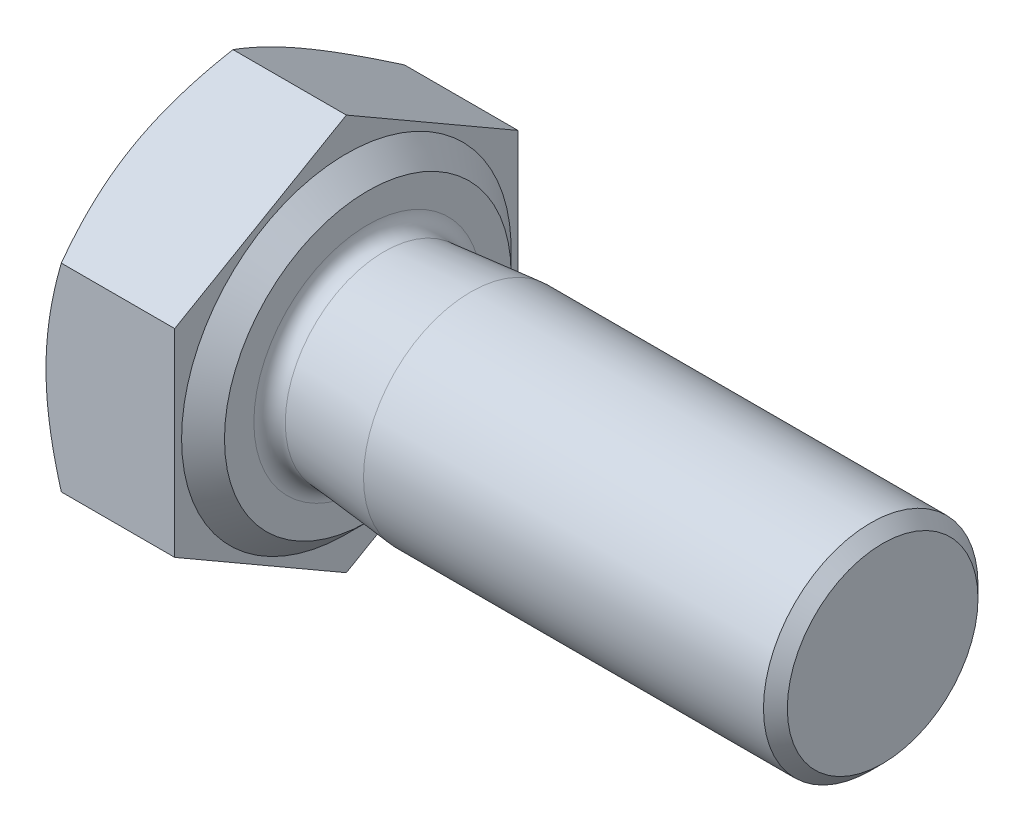
ISO-10303-21;
HEADER;
FILE_DESCRIPTION(('STEP AP214'),'2;1');
FILE_NAME('part.step','',(''),(''),'','','');
FILE_SCHEMA(('AUTOMOTIVE_DESIGN { 1 0 10303 214 1 1 1 1 }'));
ENDSEC;
DATA;
#1=APPLICATION_CONTEXT('core data for automotive mechanical design processes');
#2=APPLICATION_PROTOCOL_DEFINITION('international standard','automotive_design',2000,#1);
#3=PRODUCT_CONTEXT('',#1,'mechanical');
#4=PRODUCT('Part','Part','',(#3));
#5=PRODUCT_RELATED_PRODUCT_CATEGORY('part','',(#4));
#6=PRODUCT_DEFINITION_FORMATION('','',#4);
#7=PRODUCT_DEFINITION_CONTEXT('part definition',#1,'design');
#8=PRODUCT_DEFINITION('design','',#6,#7);
#9=PRODUCT_DEFINITION_SHAPE('','',#8);
#10=(LENGTH_UNIT() NAMED_UNIT(*) SI_UNIT(.MILLI.,.METRE.));
#11=(NAMED_UNIT(*) PLANE_ANGLE_UNIT() SI_UNIT($,.RADIAN.));
#12=(NAMED_UNIT(*) SI_UNIT($,.STERADIAN.) SOLID_ANGLE_UNIT());
#13=UNCERTAINTY_MEASURE_WITH_UNIT(LENGTH_MEASURE(1.E-05),#10,'distance_accuracy_value','');
#14=(GEOMETRIC_REPRESENTATION_CONTEXT(3) GLOBAL_UNCERTAINTY_ASSIGNED_CONTEXT((#13)) GLOBAL_UNIT_ASSIGNED_CONTEXT((#10,
#11,#12)) REPRESENTATION_CONTEXT('',''));
#15=CARTESIAN_POINT('',(0.,0.,0.));
#16=DIRECTION('',(0.,0.,1.));
#17=DIRECTION('',(1.,0.,0.));
#18=AXIS2_PLACEMENT_3D('',#15,#16,#17);
#19=CARTESIAN_POINT('',(3.5,2.30940107675851,-4.));
#20=DIRECTION('',(1.,0.,0.));
#21=DIRECTION('',(0.,0.,-1.));
#22=AXIS2_PLACEMENT_3D('',#19,#20,#21);
#23=PLANE('',#22);
#24=CARTESIAN_POINT('',(3.5,0.,0.));
#25=DIRECTION('',(-1.,0.,0.));
#26=DIRECTION('',(0.,0.,1.));
#27=AXIS2_PLACEMENT_3D('',#24,#25,#26);
#28=CIRCLE('',#27,2.65515);
#29=CARTESIAN_POINT('',(3.5,0.,2.65515));
#30=VERTEX_POINT('',#29);
#31=EDGE_CURVE('E174',#30,#30,#28,.T.);
#32=ORIENTED_EDGE('',*,*,#31,.T.);
#33=EDGE_LOOP('',(#32));
#34=FACE_BOUND('',#33,.T.);
#35=CARTESIAN_POINT('',(3.5,0.,0.));
#36=DIRECTION('',(-1.,0.,0.));
#37=DIRECTION('',(0.,0.,1.));
#38=AXIS2_PLACEMENT_3D('',#35,#36,#37);
#39=CIRCLE('',#38,3.34);
#40=CARTESIAN_POINT('',(3.5,0.,3.34));
#41=VERTEX_POINT('',#40);
#42=EDGE_CURVE('E252',#41,#41,#39,.T.);
#43=ORIENTED_EDGE('',*,*,#42,.F.);
#44=EDGE_LOOP('',(#43));
#45=FACE_BOUND('',#44,.T.);
#46=ADVANCED_FACE('F34',(#34,#45),#23,.T.);
#47=CARTESIAN_POINT('',(5.9,0.,0.));
#48=DIRECTION('',(1.,0.,0.));
#49=DIRECTION('',(0.,0.,-1.));
#50=AXIS2_PLACEMENT_3D('',#47,#48,#49);
#51=CONICAL_SURFACE('',#50,2.5,0.0955392013341482);
#52=CARTESIAN_POINT('',(3.88338787369287,0.,0.));
#53=DIRECTION('',(-1.,0.,0.));
#54=DIRECTION('',(0.,0.,1.));
#55=AXIS2_PLACEMENT_3D('',#52,#53,#54);
#56=CIRCLE('',#55,2.3067461396737);
#57=CARTESIAN_POINT('',(3.88338787369287,0.,2.3067461396737));
#58=VERTEX_POINT('',#57);
#59=EDGE_CURVE('E118',#58,#58,#56,.T.);
#60=ORIENTED_EDGE('',*,*,#59,.F.);
#61=EDGE_LOOP('',(#60));
#62=FACE_BOUND('',#61,.T.);
#63=CARTESIAN_POINT('',(5.9,0.,0.));
#64=DIRECTION('',(-1.,0.,0.));
#65=DIRECTION('',(0.,0.,1.));
#66=AXIS2_PLACEMENT_3D('',#63,#64,#65);
#67=CIRCLE('',#66,2.5);
#68=CARTESIAN_POINT('',(5.9,0.,2.5));
#69=VERTEX_POINT('',#68);
#70=EDGE_CURVE('E171',#69,#69,#67,.T.);
#71=ORIENTED_EDGE('',*,*,#70,.T.);
#72=EDGE_LOOP('',(#71));
#73=FACE_BOUND('',#72,.T.);
#74=ADVANCED_FACE('F167',(#62,#73),#51,.T.);
#75=CARTESIAN_POINT('',(3.5,0.,0.));
#76=DIRECTION('',(-1.,0.,0.));
#77=DIRECTION('',(0.,0.,1.));
#78=AXIS2_PLACEMENT_3D('',#75,#76,#77);
#79=CYLINDRICAL_SURFACE('',#78,2.5);
#80=CARTESIAN_POINT('',(15.2222222222222,0.,0.));
#81=DIRECTION('',(-1.,0.,0.));
#82=DIRECTION('',(0.,0.,1.));
#83=AXIS2_PLACEMENT_3D('',#80,#81,#82);
#84=CIRCLE('',#83,2.5);
#85=CARTESIAN_POINT('',(15.2222222222222,0.,2.5));
#86=VERTEX_POINT('',#85);
#87=EDGE_CURVE('E152',#86,#86,#84,.T.);
#88=ORIENTED_EDGE('',*,*,#87,.T.);
#89=EDGE_LOOP('',(#88));
#90=FACE_BOUND('',#89,.T.);
#91=ORIENTED_EDGE('',*,*,#70,.F.);
#92=EDGE_LOOP('',(#91));
#93=FACE_BOUND('',#92,.T.);
#94=ADVANCED_FACE('F164',(#90,#93),#79,.T.);
#95=CARTESIAN_POINT('',(15.5,2.5,0.));
#96=DIRECTION('',(-1.,0.,0.));
#97=DIRECTION('',(0.,0.,1.));
#98=AXIS2_PLACEMENT_3D('',#95,#96,#97);
#99=PLANE('',#98);
#100=CARTESIAN_POINT('',(15.5,0.,0.));
#101=DIRECTION('',(-1.,0.,0.));
#102=DIRECTION('',(0.,0.,1.));
#103=AXIS2_PLACEMENT_3D('',#100,#101,#102);
#104=CIRCLE('',#103,2.22222222222222);
#105=CARTESIAN_POINT('',(15.5,0.,2.22222222222222));
#106=VERTEX_POINT('',#105);
#107=EDGE_CURVE('E42',#106,#106,#104,.F.);
#108=ORIENTED_EDGE('',*,*,#107,.T.);
#109=EDGE_LOOP('',(#108));
#110=FACE_BOUND('',#109,.T.);
#111=ADVANCED_FACE('F157',(#110),#99,.F.);
#112=CARTESIAN_POINT('',(3.85000000000001,0.,0.));
#113=DIRECTION('',(-1.,0.,0.));
#114=DIRECTION('',(0.,0.,1.));
#115=AXIS2_PLACEMENT_3D('',#112,#113,#114);
#116=TOROIDAL_SURFACE('',#115,2.65515,0.350000000000002);
#117=ORIENTED_EDGE('',*,*,#31,.F.);
#118=EDGE_LOOP('',(#117));
#119=FACE_BOUND('',#118,.T.);
#120=ORIENTED_EDGE('',*,*,#59,.T.);
#121=EDGE_LOOP('',(#120));
#122=FACE_BOUND('',#121,.T.);
#123=ADVANCED_FACE('F161',(#119,#122),#116,.F.);
#124=CARTESIAN_POINT('',(15.2222222222222,0.,0.));
#125=DIRECTION('',(-1.,0.,0.));
#126=DIRECTION('',(0.,0.,1.));
#127=AXIS2_PLACEMENT_3D('',#124,#125,#126);
#128=CONICAL_SURFACE('',#127,2.5,0.785398163397455);
#129=ORIENTED_EDGE('',*,*,#107,.F.);
#130=EDGE_LOOP('',(#129));
#131=FACE_BOUND('',#130,.T.);
#132=ORIENTED_EDGE('',*,*,#87,.F.);
#133=EDGE_LOOP('',(#132));
#134=FACE_BOUND('',#133,.T.);
#135=ADVANCED_FACE('F36',(#131,#134),#128,.T.);
#136=CARTESIAN_POINT('',(3.,-3.84,0.));
#137=DIRECTION('',(1.,0.,0.));
#138=DIRECTION('',(0.,0.,-1.));
#139=AXIS2_PLACEMENT_3D('',#136,#137,#138);
#140=PLANE('',#139);
#141=CARTESIAN_POINT('',(3.,0.,0.));
#142=DIRECTION('',(-1.,0.,0.));
#143=DIRECTION('',(0.,0.,1.));
#144=AXIS2_PLACEMENT_3D('',#141,#142,#143);
#145=CIRCLE('',#144,3.84);
#146=CARTESIAN_POINT('',(3.,0.,3.84));
#147=VERTEX_POINT('',#146);
#148=EDGE_CURVE('E254',#147,#147,#145,.T.);
#149=ORIENTED_EDGE('',*,*,#148,.T.);
#150=EDGE_LOOP('',(#149));
#151=FACE_BOUND('',#150,.T.);
#152=DIRECTION('',(0.,1.,0.));
#153=VECTOR('',#152,1.);
#154=CARTESIAN_POINT('',(3.,-2.30940107675854,-3.99999999999998));
#155=LINE('',#154,#153);
#156=CARTESIAN_POINT('',(3.,-2.30940107675854,-3.99999999999998));
#157=VERTEX_POINT('',#156);
#158=CARTESIAN_POINT('',(3.,2.30940107675851,-4.));
#159=VERTEX_POINT('',#158);
#160=EDGE_CURVE('E105',#157,#159,#155,.T.);
#161=ORIENTED_EDGE('',*,*,#160,.T.);
#162=DIRECTION('',(0.,0.5,0.866025403784439));
#163=VECTOR('',#162,1.);
#164=CARTESIAN_POINT('',(3.,2.30940107675851,-4.));
#165=LINE('',#164,#163);
#166=CARTESIAN_POINT('',(3.,4.61880215351701,0.));
#167=VERTEX_POINT('',#166);
#168=EDGE_CURVE('E119',#159,#167,#165,.T.);
#169=ORIENTED_EDGE('',*,*,#168,.T.);
#170=DIRECTION('',(0.,-0.499999999999999,0.866025403784439));
#171=VECTOR('',#170,1.);
#172=CARTESIAN_POINT('',(3.,4.61880215351701,0.));
#173=LINE('',#172,#171);
#174=CARTESIAN_POINT('',(3.,2.30940107675851,4.));
#175=VERTEX_POINT('',#174);
#176=EDGE_CURVE('E262',#167,#175,#173,.T.);
#177=ORIENTED_EDGE('',*,*,#176,.T.);
#178=DIRECTION('',(0.,-1.,0.));
#179=VECTOR('',#178,1.);
#180=CARTESIAN_POINT('',(3.,2.30940107675851,4.));
#181=LINE('',#180,#179);
#182=CARTESIAN_POINT('',(3.,-2.30940107675849,4.00000000000001));
#183=VERTEX_POINT('',#182);
#184=EDGE_CURVE('E260',#175,#183,#181,.T.);
#185=ORIENTED_EDGE('',*,*,#184,.T.);
#186=DIRECTION('',(0.,-0.500000000000001,-0.866025403784438));
#187=VECTOR('',#186,1.);
#188=CARTESIAN_POINT('',(3.,-2.30940107675849,4.00000000000001));
#189=LINE('',#188,#187);
#190=CARTESIAN_POINT('',(3.,-4.61880215351701,0.));
#191=VERTEX_POINT('',#190);
#192=EDGE_CURVE('E48',#183,#191,#189,.T.);
#193=ORIENTED_EDGE('',*,*,#192,.T.);
#194=DIRECTION('',(0.,0.499999999999997,-0.86602540378444));
#195=VECTOR('',#194,1.);
#196=CARTESIAN_POINT('',(3.,-4.61880215351701,0.));
#197=LINE('',#196,#195);
#198=EDGE_CURVE('E11',#191,#157,#197,.T.);
#199=ORIENTED_EDGE('',*,*,#198,.T.);
#200=EDGE_LOOP('',(#161,#169,#177,#185,#193,#199));
#201=FACE_BOUND('',#200,.T.);
#202=ADVANCED_FACE('F104',(#151,#201),#140,.T.);
#203=CARTESIAN_POINT('',(3.,0.,0.));
#204=DIRECTION('',(-1.,0.,0.));
#205=DIRECTION('',(0.,0.,1.));
#206=AXIS2_PLACEMENT_3D('',#203,#204,#205);
#207=CONICAL_SURFACE('',#206,3.84,0.785398163397442);
#208=ORIENTED_EDGE('',*,*,#42,.T.);
#209=EDGE_LOOP('',(#208));
#210=FACE_BOUND('',#209,.T.);
#211=ORIENTED_EDGE('',*,*,#148,.F.);
#212=EDGE_LOOP('',(#211));
#213=FACE_BOUND('',#212,.T.);
#214=ADVANCED_FACE('F277',(#210,#213),#207,.T.);
#215=CARTESIAN_POINT('',(0.,2.30940107675851,-4.));
#216=DIRECTION('',(1.,0.,0.));
#217=DIRECTION('',(0.,0.,-1.));
#218=AXIS2_PLACEMENT_3D('',#215,#216,#217);
#219=PLANE('',#218);
#220=CARTESIAN_POINT('',(0.,0.,0.));
#221=DIRECTION('',(1.,0.,0.));
#222=DIRECTION('',(0.,0.,-1.));
#223=AXIS2_PLACEMENT_3D('',#220,#221,#222);
#224=CIRCLE('',#223,4.);
#225=CARTESIAN_POINT('',(0.,0.,-4.));
#226=VERTEX_POINT('',#225);
#227=CARTESIAN_POINT('',(0.,3.46410161513775,-2.));
#228=VERTEX_POINT('',#227);
#229=EDGE_CURVE('E151',#226,#228,#224,.T.);
#230=ORIENTED_EDGE('',*,*,#229,.F.);
#231=CARTESIAN_POINT('',(0.,-3.46410161513777,-2.));
#232=VERTEX_POINT('',#231);
#233=EDGE_CURVE('E147',#232,#226,#224,.T.);
#234=ORIENTED_EDGE('',*,*,#233,.F.);
#235=CARTESIAN_POINT('',(0.,-3.46410161513775,2.));
#236=VERTEX_POINT('',#235);
#237=EDGE_CURVE('E150',#236,#232,#224,.T.);
#238=ORIENTED_EDGE('',*,*,#237,.F.);
#239=CARTESIAN_POINT('',(0.,0.,4.));
#240=VERTEX_POINT('',#239);
#241=EDGE_CURVE('E318',#240,#236,#224,.T.);
#242=ORIENTED_EDGE('',*,*,#241,.F.);
#243=CARTESIAN_POINT('',(0.,0.,0.));
#244=DIRECTION('',(-1.,0.,0.));
#245=DIRECTION('',(0.,0.,1.));
#246=AXIS2_PLACEMENT_3D('',#243,#244,#245);
#247=CIRCLE('',#246,4.);
#248=CARTESIAN_POINT('',(0.,3.46410161513775,2.));
#249=VERTEX_POINT('',#248);
#250=EDGE_CURVE('E173',#240,#249,#247,.T.);
#251=ORIENTED_EDGE('',*,*,#250,.T.);
#252=EDGE_CURVE('E295',#228,#249,#224,.T.);
#253=ORIENTED_EDGE('',*,*,#252,.F.);
#254=EDGE_LOOP('',(#230,#234,#238,#242,#251,#253));
#255=FACE_BOUND('',#254,.T.);
#256=ADVANCED_FACE('F280',(#255),#219,.F.);
#257=CARTESIAN_POINT('',(0.,0.,0.));
#258=DIRECTION('',(1.,0.,0.));
#259=DIRECTION('',(0.,0.,1.));
#260=AXIS2_PLACEMENT_3D('',#257,#258,#259);
#261=CONICAL_SURFACE('',#260,4.,1.0471975511966);
#262=CARTESIAN_POINT('',(0.35733225907477,4.61891762357085,0.00019999999999805));
#263=CARTESIAN_POINT('',(0.298717873648286,4.51743148381381,-0.175579150323231));
#264=CARTESIAN_POINT('',(0.245410321462266,4.41506932144052,-0.352875616326384));
#265=CARTESIAN_POINT('',(0.152361670746407,4.2085725054774,-0.710538593175709));
#266=CARTESIAN_POINT('',(0.112653489029708,4.10443418285647,-0.890911458970154));
#267=CARTESIAN_POINT('',(0.0508422152802831,3.89744813015756,-1.24942181870279));
#268=CARTESIAN_POINT('',(0.0283277315228931,3.7946322465506,-1.42750415293515));
#269=CARTESIAN_POINT('',(0.00145062314658626,3.58851671999023,-1.78450671716651));
#270=CARTESIAN_POINT('',(-0.00293425857305235,3.48521782616117,-1.9634256496441));
#271=CARTESIAN_POINT('',(0.00619007293997495,3.29219970504619,-2.29774284219674));
#272=CARTESIAN_POINT('',(0.0174589539879991,3.20245157692487,-2.45319115998707));
#273=CARTESIAN_POINT('',(0.0531739907981978,3.02354002635497,-2.76307505563506));
#274=CARTESIAN_POINT('',(0.0776323457115373,2.93437722268073,-2.91750956174413));
#275=CARTESIAN_POINT('',(0.138776064919293,2.75509682012355,-3.22803232777458));
#276=CARTESIAN_POINT('',(0.175720603654866,2.66500191089421,-3.3840812880631));
#277=CARTESIAN_POINT('',(0.259570072548029,2.48615580200001,-3.69385183540384));
#278=CARTESIAN_POINT('',(0.306455302212742,2.39740231122586,-3.84757739077378));
#279=CARTESIAN_POINT('',(0.357332259074768,2.30928560670467,-4.0002));
#280=B_SPLINE_CURVE_WITH_KNOTS('',3,(#262,#263,#264,#265,#266,#267,#268,#269,#270,#271,#272,
#273,#274,#275,#276,#277,#278,#279),.UNSPECIFIED.,.F.,.F.,(4,2,2,2,2,2,2,2,4),(0.,
0.634047835695966,1.26961969224543,1.88946157213122,2.50854226669297,3.04757825393386,
3.58711366126903,4.13861653143763,4.68903648037742),.UNSPECIFIED.);
#281=CARTESIAN_POINT('',(0.357265589908164,2.30940107675851,-4.));
#282=VERTEX_POINT('',#281);
#283=EDGE_CURVE('E225',#228,#282,#280,.T.);
#284=ORIENTED_EDGE('',*,*,#283,.T.);
#285=CARTESIAN_POINT('',(1.91949131906031,-6.13600787860014,-3.99999999999997));
#286=CARTESIAN_POINT('',(1.83453254114692,-5.96029824528281,-3.99999999999997));
#287=CARTESIAN_POINT('',(1.75041491774215,-5.78417443504921,-3.99999999999997));
#288=CARTESIAN_POINT('',(1.58434238711561,-5.43087457241901,-3.99999999999997));
#289=CARTESIAN_POINT('',(1.50238785174126,-5.25369834543672,-3.99999999999997));
#290=CARTESIAN_POINT('',(1.34069258944118,-4.89711815344377,-3.99999999999997));
#291=CARTESIAN_POINT('',(1.2609671107701,-4.71770724899219,-3.99999999999998));
#292=CARTESIAN_POINT('',(1.10492454769553,-4.35741495082771,-3.99999999999998));
#293=CARTESIAN_POINT('',(1.0286072865682,-4.17653363393527,-3.99999999999998));
#294=CARTESIAN_POINT('',(0.879359740575396,-3.81071561786163,-3.99999999999998));
#295=CARTESIAN_POINT('',(0.80648405731675,-3.62575651977364,-3.99999999999998));
#296=CARTESIAN_POINT('',(0.666412540786886,-3.25366068255849,-3.99999999999998));
#297=CARTESIAN_POINT('',(0.599217338066289,-3.06652370429613,-3.99999999999998));
#298=CARTESIAN_POINT('',(0.472304167658768,-2.69015503897306,-3.99999999999998));
#299=CARTESIAN_POINT('',(0.412570399692845,-2.50092873463207,-3.99999999999998));
#300=CARTESIAN_POINT('',(0.302512840080975,-2.11978551535808,-3.99999999999998));
#301=CARTESIAN_POINT('',(0.252186084020131,-1.92786946860207,-3.99999999999998));
#302=CARTESIAN_POINT('',(0.163379771912551,-1.54122028912674,-3.99999999999999));
#303=CARTESIAN_POINT('',(0.124902777698588,-1.34648655675811,-3.99999999999999));
#304=CARTESIAN_POINT('',(0.0623769826458263,-0.954658832260081,-3.99999999999999));
#305=CARTESIAN_POINT('',(0.0383281826610804,-0.757564839990973,-3.99999999999999));
#306=CARTESIAN_POINT('',(0.00678594419352145,-0.363304194123938,-3.99999999999999));
#307=CARTESIAN_POINT('',(-0.000813464833915623,-0.166146239239637,-3.99999999999999));
#308=CARTESIAN_POINT('',(0.000951740706278187,0.228050062110494,-3.99999999999999));
#309=CARTESIAN_POINT('',(0.0103118940041482,0.425088426396362,-3.99999999999999));
#310=CARTESIAN_POINT('',(0.040085248119804,0.761210581117507,-3.99999999999999));
#311=CARTESIAN_POINT('',(0.0565453952791145,0.900664377876312,-3.99999999999999));
#312=CARTESIAN_POINT('',(0.0968962874886259,1.17850220880597,-3.99999999999999));
#313=CARTESIAN_POINT('',(0.120788195049948,1.31688607213958,-3.99999999999999));
#314=CARTESIAN_POINT('',(0.202358575058061,1.73031595246286,-3.99999999999999));
#315=CARTESIAN_POINT('',(0.269910951597834,2.00343275055545,-4.));
#316=CARTESIAN_POINT('',(0.386514913879454,2.41213205945729,-4.));
#317=CARTESIAN_POINT('',(0.428526952638739,2.54984255586082,-4.));
#318=CARTESIAN_POINT('',(0.516731740349217,2.82382651940195,-4.));
#319=CARTESIAN_POINT('',(0.562921614665063,2.96010090367581,-4.));
#320=CARTESIAN_POINT('',(0.658519068779255,3.23064293966594,-4.));
#321=CARTESIAN_POINT('',(0.707907115663071,3.36491756386987,-4.));
#322=CARTESIAN_POINT('',(0.809597306890866,3.63242301131994,-4.));
#323=CARTESIAN_POINT('',(0.861900619604669,3.76565339130134,-4.));
#324=CARTESIAN_POINT('',(0.915374388530293,3.89840100612876,-4.));
#325=B_SPLINE_CURVE_WITH_KNOTS('',3,(#285,#286,#287,#288,#289,#290,#291,#292,#293,#294,#295,
#296,#297,#298,#299,#300,#301,#302,#303,#304,#305,#306,#307,#308,#309,#310,#311,#312,#313,#314,
#315,#316,#317,#318,#319,#320,#321,#322,#323,#324),.UNSPECIFIED.,.F.,.F.,(4,2,2,2,2,2,2,2,2,2,2,
2,2,2,2,2,2,2,2,4),(0.,0.585521951029805,1.17114390962969,1.76009774380607,2.34902100384485,
2.94534356731019,3.54173223771425,4.13683578232763,4.73175147568506,5.32679569536903,
5.92183995027563,6.51303924843911,7.10408305222163,7.52514324349571,7.94626933214689,
8.78914432607458,9.22103879153916,9.65263831261068,10.0818133381383,10.5111616212701),.UNSPECIFIED.);
#326=EDGE_CURVE('E297',#282,#226,#325,.F.);
#327=ORIENTED_EDGE('',*,*,#326,.T.);
#328=ORIENTED_EDGE('',*,*,#229,.T.);
#329=EDGE_LOOP('',(#284,#327,#328));
#330=FACE_BOUND('',#329,.T.);
#331=ADVANCED_FACE('F284',(#330),#261,.T.);
#332=CARTESIAN_POINT('',(0.357332259074769,2.30928560670467,4.0002));
#333=CARTESIAN_POINT('',(0.298717873648285,2.41077174646171,3.82442084967677));
#334=CARTESIAN_POINT('',(0.245410321462265,2.513133908835,3.64712438367362));
#335=CARTESIAN_POINT('',(0.152361670746406,2.71963072479812,3.28946140682429));
#336=CARTESIAN_POINT('',(0.112653489029707,2.82376904741905,3.10908854102984));
#337=CARTESIAN_POINT('',(0.0508422152802822,3.03075510011796,2.75057818129721));
#338=CARTESIAN_POINT('',(0.0283277315228925,3.13357098372492,2.57249584706485));
#339=CARTESIAN_POINT('',(0.0014506231465858,3.33968651028529,2.21549328283349));
#340=CARTESIAN_POINT('',(-0.00293425857305308,3.44298540411435,2.03657435035589));
#341=CARTESIAN_POINT('',(0.00619007293997406,3.63600352522933,1.70225715780326));
#342=CARTESIAN_POINT('',(0.0174589539879983,3.72575165335065,1.54680884001293));
#343=CARTESIAN_POINT('',(0.0531739907981973,3.90466320392055,1.23692494436494));
#344=CARTESIAN_POINT('',(0.0776323457115371,3.99382600759479,1.08249043825587));
#345=CARTESIAN_POINT('',(0.138776064919293,4.17310641015198,0.771967672225418));
#346=CARTESIAN_POINT('',(0.175720603654867,4.26320131938132,0.615918711936894));
#347=CARTESIAN_POINT('',(0.25957007254803,4.44204742827551,0.306148164596158));
#348=CARTESIAN_POINT('',(0.306455302212743,4.53080091904967,0.152422609226218));
#349=CARTESIAN_POINT('',(0.35733225907477,4.61891762357085,-0.000200000000001869));
#350=B_SPLINE_CURVE_WITH_KNOTS('',3,(#332,#333,#334,#335,#336,#337,#338,#339,#340,#341,#342,
#343,#344,#345,#346,#347,#348,#349),.UNSPECIFIED.,.F.,.F.,(4,2,2,2,2,2,2,2,4),(0.,
0.634047835695965,1.26961969224543,1.88946157213122,2.50854226669297,3.04757825393386,
3.58711366126903,4.13861653143763,4.68903648037743),.UNSPECIFIED.);
#351=CARTESIAN_POINT('',(0.357265589908166,4.61880215351701,0.));
#352=VERTEX_POINT('',#351);
#353=EDGE_CURVE('E131',#249,#352,#350,.T.);
#354=ORIENTED_EDGE('',*,*,#353,.T.);
#355=EDGE_CURVE('E56',#352,#228,#280,.T.);
#356=ORIENTED_EDGE('',*,*,#355,.T.);
#357=ORIENTED_EDGE('',*,*,#252,.T.);
#358=EDGE_LOOP('',(#354,#356,#357));
#359=FACE_BOUND('',#358,.T.);
#360=ADVANCED_FACE('F205',(#359),#261,.T.);
#361=CARTESIAN_POINT('',(0.357265589908164,2.30940107675851,4.));
#362=VERTEX_POINT('',#361);
#363=EDGE_CURVE('E127',#362,#249,#350,.T.);
#364=ORIENTED_EDGE('',*,*,#363,.T.);
#365=ORIENTED_EDGE('',*,*,#250,.F.);
#366=CARTESIAN_POINT('',(1.91949120646931,-6.13600764580939,4.00000000000002));
#367=CARTESIAN_POINT('',(1.83453243337032,-5.96029802046226,4.00000000000002));
#368=CARTESIAN_POINT('',(1.75041481477709,-5.78417421820494,4.00000000000002));
#369=CARTESIAN_POINT('',(1.58434229374799,-5.43087437155386,4.00000000000002));
#370=CARTESIAN_POINT('',(1.50238776315955,-5.25369815257442,4.00000000000002));
#371=CARTESIAN_POINT('',(1.34069251043344,-4.89711797672013,4.00000000000002));
#372=CARTESIAN_POINT('',(1.26096703654941,-4.71770708040489,4.00000000000002));
#373=CARTESIAN_POINT('',(1.10492448296113,-4.35741479857339,4.00000000000002));
#374=CARTESIAN_POINT('',(1.02860722653305,-4.17653348987757,4.00000000000002));
#375=CARTESIAN_POINT('',(0.879359689861999,-3.81071549042518,4.00000000000002));
#376=CARTESIAN_POINT('',(0.806484011223184,-3.62575640076333,4.00000000000002));
#377=CARTESIAN_POINT('',(0.666412503677517,-3.25366058054104,4.00000000000001));
#378=CARTESIAN_POINT('',(0.599217305321195,-3.06652361084543,4.00000000000001));
#379=CARTESIAN_POINT('',(0.472304143209208,-2.69015496281749,4.00000000000001));
#380=CARTESIAN_POINT('',(0.412570379175942,-2.5009286672043,4.00000000000001));
#381=CARTESIAN_POINT('',(0.302512826766215,-2.1197854656258,4.00000000000001));
#382=CARTESIAN_POINT('',(0.252186073975287,-1.92786942783734,4.00000000000001));
#383=CARTESIAN_POINT('',(0.163379768486074,-1.54122027124256,4.00000000000001));
#384=CARTESIAN_POINT('',(0.124902777334436,-1.34648655285392,4.00000000000001));
#385=CARTESIAN_POINT('',(0.0623769862766003,-0.954658856631734,4.00000000000001));
#386=CARTESIAN_POINT('',(0.0383281872259856,-0.757564878658228,4.00000000000001));
#387=CARTESIAN_POINT('',(0.00678594810879021,-0.363304261313727,4.));
#388=CARTESIAN_POINT('',(-0.000813462481064327,-0.16614632065538,4.));
#389=CARTESIAN_POINT('',(0.000951737499979277,0.22804995248298,4.));
#390=CARTESIAN_POINT('',(0.0103118868006022,0.425088302782968,4.));
#391=CARTESIAN_POINT('',(0.0400852329091964,0.761210439648584,4.));
#392=CARTESIAN_POINT('',(0.0565453768668471,0.900664232381911,4.));
#393=CARTESIAN_POINT('',(0.0968962624971283,1.17850205543051,4.));
#394=CARTESIAN_POINT('',(0.120788166680851,1.31688591490858,4.));
#395=CARTESIAN_POINT('',(0.202358536474655,1.73031578385203,4.));
#396=CARTESIAN_POINT('',(0.269910906102915,2.00343257463138,4.));
#397=CARTESIAN_POINT('',(0.386514858161894,2.41213187260233,4.));
#398=CARTESIAN_POINT('',(0.428526893488739,2.54984236530054,4.));
#399=CARTESIAN_POINT('',(0.51673167443411,2.82382632147354,3.99999999999999));
#400=CARTESIAN_POINT('',(0.562921545417337,2.96010070208453,3.99999999999999));
#401=CARTESIAN_POINT('',(0.658518992997691,3.23064273080269,3.99999999999999));
#402=CARTESIAN_POINT('',(0.707907036680203,3.36491735139727,3.99999999999999));
#403=CARTESIAN_POINT('',(0.809597221602637,3.63242279162073,3.99999999999999));
#404=CARTESIAN_POINT('',(0.861900531212279,3.76565316798494,3.99999999999999));
#405=CARTESIAN_POINT('',(0.915374297081839,3.89840077918901,3.99999999999999));
#406=B_SPLINE_CURVE_WITH_KNOTS('',3,(#366,#367,#368,#369,#370,#371,#372,#373,#374,#375,#376,
#377,#378,#379,#380,#381,#382,#383,#384,#385,#386,#387,#388,#389,#390,#391,#392,#393,#394,#395,
#396,#397,#398,#399,#400,#401,#402,#403,#404,#405),.UNSPECIFIED.,.F.,.F.,(4,2,2,2,2,2,2,2,2,2,2,
2,2,2,2,2,2,2,2,4),(0.,0.585521923216113,1.17114385399772,1.76009766003639,2.3490208919397,
2.94534342680831,3.54173206860598,4.13683558471493,4.73175124959096,5.32679542644494,
5.92183963858471,6.51303889444524,7.10408265589568,7.52514283405346,7.94626890958621,
8.78914387720299,9.22103832902587,9.6526378364765,10.0818128485231,10.5111611181472),.UNSPECIFIED.);
#407=EDGE_CURVE('E308',#240,#362,#406,.T.);
#408=ORIENTED_EDGE('',*,*,#407,.T.);
#409=EDGE_LOOP('',(#364,#365,#408));
#410=FACE_BOUND('',#409,.T.);
#411=ADVANCED_FACE('F199',(#410),#261,.T.);
#412=CARTESIAN_POINT('',(0.357265589908165,-2.30940107675849,4.00000000000001));
#413=VERTEX_POINT('',#412);
#414=EDGE_CURVE('E219',#413,#240,#406,.T.);
#415=ORIENTED_EDGE('',*,*,#414,.T.);
#416=ORIENTED_EDGE('',*,*,#241,.T.);
#417=CARTESIAN_POINT('',(0.357332259074769,-4.61891762357085,-0.000200000000004817));
#418=CARTESIAN_POINT('',(0.298717873648285,-4.51743148381381,0.175579150323223));
#419=CARTESIAN_POINT('',(0.245410321462265,-4.41506932144052,0.352875616326376));
#420=CARTESIAN_POINT('',(0.152361670746406,-4.2085725054774,0.710538593175702));
#421=CARTESIAN_POINT('',(0.112653489029706,-4.10443418285647,0.890911458970146));
#422=CARTESIAN_POINT('',(0.0508422152802806,-3.89744813015756,1.24942181870279));
#423=CARTESIAN_POINT('',(0.0283277315228898,-3.79463224655059,1.42750415293514));
#424=CARTESIAN_POINT('',(0.00145062314658228,-3.58851671999023,1.7845067171665));
#425=CARTESIAN_POINT('',(-0.00293425857305625,-3.48521782616117,1.96342564964409));
#426=CARTESIAN_POINT('',(0.00619007293997031,-3.29219970504619,2.29774284219673));
#427=CARTESIAN_POINT('',(0.0174589539879939,-3.20245157692486,2.45319115998706));
#428=CARTESIAN_POINT('',(0.0531739907981924,-3.02354002635496,2.76307505563505));
#429=CARTESIAN_POINT('',(0.0776323457115322,-2.93437722268072,2.91750956174413));
#430=CARTESIAN_POINT('',(0.138776064919289,-2.75509682012353,3.22803232777458));
#431=CARTESIAN_POINT('',(0.175720603654864,-2.66500191089419,3.38408128806311));
#432=CARTESIAN_POINT('',(0.259570072548029,-2.486155802,3.69385183540385));
#433=CARTESIAN_POINT('',(0.306455302212743,-2.39740231122584,3.84757739077379));
#434=CARTESIAN_POINT('',(0.357332259074769,-2.30928560670465,4.00020000000001));
#435=B_SPLINE_CURVE_WITH_KNOTS('',3,(#417,#418,#419,#420,#421,#422,#423,#424,#425,#426,#427,
#428,#429,#430,#431,#432,#433,#434),.UNSPECIFIED.,.F.,.F.,(4,2,2,2,2,2,2,2,4),(0.,
0.634047835695966,1.26961969224543,1.88946157213122,2.50854226669297,3.04757825393386,
3.58711366126904,4.13861653143765,4.68903648037745),.UNSPECIFIED.);
#436=EDGE_CURVE('E299',#236,#413,#435,.T.);
#437=ORIENTED_EDGE('',*,*,#436,.T.);
#438=EDGE_LOOP('',(#415,#416,#437));
#439=FACE_BOUND('',#438,.T.);
#440=ADVANCED_FACE('F204',(#439),#261,.T.);
#441=CARTESIAN_POINT('',(0.357265589908165,-2.30940107675854,-3.99999999999998));
#442=VERTEX_POINT('',#441);
#443=EDGE_CURVE('E213',#226,#442,#325,.F.);
#444=ORIENTED_EDGE('',*,*,#443,.T.);
#445=CARTESIAN_POINT('',(0.357332259074769,-2.3092856067047,-4.00019999999998));
#446=CARTESIAN_POINT('',(0.298717873648285,-2.41077174646174,-3.82442084967675));
#447=CARTESIAN_POINT('',(0.245410321462266,-2.51313390883503,-3.6471243836736));
#448=CARTESIAN_POINT('',(0.152361670746408,-2.71963072479815,-3.28946140682427));
#449=CARTESIAN_POINT('',(0.112653489029709,-2.82376904741907,-3.10908854102983));
#450=CARTESIAN_POINT('',(0.0508422152802854,-3.03075510011798,-2.75057818129719));
#451=CARTESIAN_POINT('',(0.028327731522896,-3.13357098372495,-2.57249584706484));
#452=CARTESIAN_POINT('',(0.00145062314659007,-3.33968651028531,-2.21549328283347));
#453=CARTESIAN_POINT('',(-0.00293425857304821,-3.44298540411437,-2.03657435035588));
#454=CARTESIAN_POINT('',(0.00619007293997994,-3.63600352522935,-1.70225715780325));
#455=CARTESIAN_POINT('',(0.0174589539880044,-3.72575165335067,-1.54680884001292));
#456=CARTESIAN_POINT('',(0.0531739907982031,-3.90466320392056,-1.23692494436493));
#457=CARTESIAN_POINT('',(0.0776323457115423,-3.9938260075948,-1.08249043825586));
#458=CARTESIAN_POINT('',(0.138776064919297,-4.17310641015198,-0.771967672225415));
#459=CARTESIAN_POINT('',(0.175720603654871,-4.26320131938132,-0.615918711936893));
#460=CARTESIAN_POINT('',(0.259570072548033,-4.44204742827551,-0.306148164596161));
#461=CARTESIAN_POINT('',(0.306455302212745,-4.53080091904967,-0.152422609226223));
#462=CARTESIAN_POINT('',(0.35733225907477,-4.61891762357085,0.000199999999995354));
#463=B_SPLINE_CURVE_WITH_KNOTS('',3,(#445,#446,#447,#448,#449,#450,#451,#452,#453,#454,#455,
#456,#457,#458,#459,#460,#461,#462),.UNSPECIFIED.,.F.,.F.,(4,2,2,2,2,2,2,2,4),(0.,
0.634047835695966,1.26961969224543,1.88946157213122,2.50854226669297,3.04757825393385,
3.58711366126902,4.13861653143761,4.6890364803774),.UNSPECIFIED.);
#464=EDGE_CURVE('E125',#442,#232,#463,.T.);
#465=ORIENTED_EDGE('',*,*,#464,.T.);
#466=ORIENTED_EDGE('',*,*,#233,.T.);
#467=EDGE_LOOP('',(#444,#465,#466));
#468=FACE_BOUND('',#467,.T.);
#469=ADVANCED_FACE('F316',(#468),#261,.T.);
#470=CARTESIAN_POINT('',(0.357265589908166,-4.61880215351701,0.));
#471=VERTEX_POINT('',#470);
#472=EDGE_CURVE('E190',#471,#236,#435,.T.);
#473=ORIENTED_EDGE('',*,*,#472,.T.);
#474=ORIENTED_EDGE('',*,*,#237,.T.);
#475=EDGE_CURVE('E177',#232,#471,#463,.T.);
#476=ORIENTED_EDGE('',*,*,#475,.T.);
#477=EDGE_LOOP('',(#473,#474,#476));
#478=FACE_BOUND('',#477,.T.);
#479=ADVANCED_FACE('F207',(#478),#261,.T.);
#480=CARTESIAN_POINT('',(3.5,-4.61880215351701,0.));
#481=DIRECTION('',(0.,0.86602540378444,0.499999999999997));
#482=DIRECTION('',(0.,-0.499999999999997,0.86602540378444));
#483=AXIS2_PLACEMENT_3D('',#480,#481,#482);
#484=PLANE('',#483);
#485=ORIENTED_EDGE('',*,*,#198,.F.);
#486=DIRECTION('',(-1.,0.,0.));
#487=VECTOR('',#486,1.);
#488=CARTESIAN_POINT('',(3.5,-4.61880215351701,0.));
#489=LINE('',#488,#487);
#490=EDGE_CURVE('E126',#191,#471,#489,.T.);
#491=ORIENTED_EDGE('',*,*,#490,.T.);
#492=ORIENTED_EDGE('',*,*,#475,.F.);
#493=ORIENTED_EDGE('',*,*,#464,.F.);
#494=DIRECTION('',(-1.,0.,0.));
#495=VECTOR('',#494,1.);
#496=CARTESIAN_POINT('',(3.5,-2.30940107675854,-3.99999999999998));
#497=LINE('',#496,#495);
#498=EDGE_CURVE('E114',#157,#442,#497,.T.);
#499=ORIENTED_EDGE('',*,*,#498,.F.);
#500=EDGE_LOOP('',(#485,#491,#492,#493,#499));
#501=FACE_BOUND('',#500,.T.);
#502=ADVANCED_FACE('F122',(#501),#484,.F.);
#503=CARTESIAN_POINT('',(3.5,-2.30940107675849,4.00000000000001));
#504=DIRECTION('',(0.,0.866025403784438,-0.500000000000001));
#505=DIRECTION('',(0.,0.500000000000001,0.866025403784438));
#506=AXIS2_PLACEMENT_3D('',#503,#504,#505);
#507=PLANE('',#506);
#508=ORIENTED_EDGE('',*,*,#192,.F.);
#509=DIRECTION('',(-1.,0.,0.));
#510=VECTOR('',#509,1.);
#511=CARTESIAN_POINT('',(3.5,-2.30940107675849,4.00000000000001));
#512=LINE('',#511,#510);
#513=EDGE_CURVE('E129',#183,#413,#512,.T.);
#514=ORIENTED_EDGE('',*,*,#513,.T.);
#515=ORIENTED_EDGE('',*,*,#436,.F.);
#516=ORIENTED_EDGE('',*,*,#472,.F.);
#517=ORIENTED_EDGE('',*,*,#490,.F.);
#518=EDGE_LOOP('',(#508,#514,#515,#516,#517));
#519=FACE_BOUND('',#518,.T.);
#520=ADVANCED_FACE('F320',(#519),#507,.F.);
#521=CARTESIAN_POINT('',(3.5,2.30940107675851,4.));
#522=DIRECTION('',(0.,0.,-1.));
#523=DIRECTION('',(0.,1.,0.));
#524=AXIS2_PLACEMENT_3D('',#521,#522,#523);
#525=PLANE('',#524);
#526=ORIENTED_EDGE('',*,*,#184,.F.);
#527=DIRECTION('',(-1.,0.,0.));
#528=VECTOR('',#527,1.);
#529=CARTESIAN_POINT('',(3.5,2.30940107675851,4.));
#530=LINE('',#529,#528);
#531=EDGE_CURVE('E142',#175,#362,#530,.T.);
#532=ORIENTED_EDGE('',*,*,#531,.T.);
#533=ORIENTED_EDGE('',*,*,#407,.F.);
#534=ORIENTED_EDGE('',*,*,#414,.F.);
#535=ORIENTED_EDGE('',*,*,#513,.F.);
#536=EDGE_LOOP('',(#526,#532,#533,#534,#535));
#537=FACE_BOUND('',#536,.T.);
#538=ADVANCED_FACE('F324',(#537),#525,.F.);
#539=CARTESIAN_POINT('',(3.5,4.61880215351701,0.));
#540=DIRECTION('',(0.,-0.866025403784439,-0.499999999999999));
#541=DIRECTION('',(0.,0.499999999999999,-0.866025403784439));
#542=AXIS2_PLACEMENT_3D('',#539,#540,#541);
#543=PLANE('',#542);
#544=ORIENTED_EDGE('',*,*,#176,.F.);
#545=DIRECTION('',(-1.,0.,0.));
#546=VECTOR('',#545,1.);
#547=CARTESIAN_POINT('',(3.5,4.61880215351701,0.));
#548=LINE('',#547,#546);
#549=EDGE_CURVE('E144',#167,#352,#548,.T.);
#550=ORIENTED_EDGE('',*,*,#549,.T.);
#551=ORIENTED_EDGE('',*,*,#353,.F.);
#552=ORIENTED_EDGE('',*,*,#363,.F.);
#553=ORIENTED_EDGE('',*,*,#531,.F.);
#554=EDGE_LOOP('',(#544,#550,#551,#552,#553));
#555=FACE_BOUND('',#554,.T.);
#556=ADVANCED_FACE('F235',(#555),#543,.F.);
#557=CARTESIAN_POINT('',(3.5,2.30940107675851,-4.));
#558=DIRECTION('',(0.,-0.866025403784439,0.5));
#559=DIRECTION('',(0.,-0.5,-0.866025403784439));
#560=AXIS2_PLACEMENT_3D('',#557,#558,#559);
#561=PLANE('',#560);
#562=ORIENTED_EDGE('',*,*,#168,.F.);
#563=DIRECTION('',(-1.,0.,0.));
#564=VECTOR('',#563,1.);
#565=CARTESIAN_POINT('',(3.5,2.30940107675851,-4.));
#566=LINE('',#565,#564);
#567=EDGE_CURVE('E117',#159,#282,#566,.T.);
#568=ORIENTED_EDGE('',*,*,#567,.T.);
#569=ORIENTED_EDGE('',*,*,#283,.F.);
#570=ORIENTED_EDGE('',*,*,#355,.F.);
#571=ORIENTED_EDGE('',*,*,#549,.F.);
#572=EDGE_LOOP('',(#562,#568,#569,#570,#571));
#573=FACE_BOUND('',#572,.T.);
#574=ADVANCED_FACE('F232',(#573),#561,.F.);
#575=CARTESIAN_POINT('',(3.5,-2.30940107675854,-3.99999999999998));
#576=DIRECTION('',(0.,0.,1.));
#577=DIRECTION('',(0.,-1.,0.));
#578=AXIS2_PLACEMENT_3D('',#575,#576,#577);
#579=PLANE('',#578);
#580=ORIENTED_EDGE('',*,*,#160,.F.);
#581=ORIENTED_EDGE('',*,*,#498,.T.);
#582=ORIENTED_EDGE('',*,*,#443,.F.);
#583=ORIENTED_EDGE('',*,*,#326,.F.);
#584=ORIENTED_EDGE('',*,*,#567,.F.);
#585=EDGE_LOOP('',(#580,#581,#582,#583,#584));
#586=FACE_BOUND('',#585,.T.);
#587=ADVANCED_FACE('F112',(#586),#579,.F.);
#588=CLOSED_SHELL('',(#46,#74,#94,#111,#123,#135,#202,#214,#256,#331,#360,#411,#440,#469,#479,
#502,#520,#538,#556,#574,#587));
#589=MANIFOLD_SOLID_BREP('B2',#588);
#590=ADVANCED_BREP_SHAPE_REPRESENTATION('',(#18,#589),#14);
#591=SHAPE_DEFINITION_REPRESENTATION(#9,#590);
ENDSEC;
END-ISO-10303-21;
